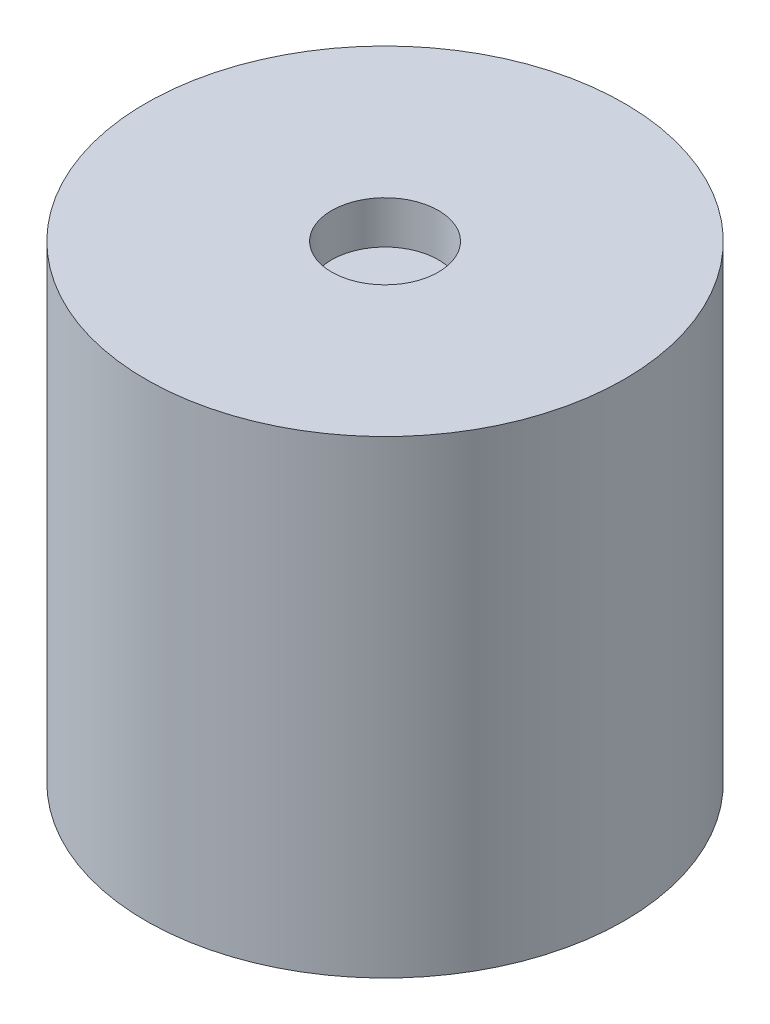
ISO-10303-21;
HEADER;
FILE_DESCRIPTION(('STEP AP214'),'2;1');
FILE_NAME('part.step','',(''),(''),'','','');
FILE_SCHEMA(('AUTOMOTIVE_DESIGN { 1 0 10303 214 1 1 1 1 }'));
ENDSEC;
DATA;
#1=APPLICATION_CONTEXT('core data for automotive mechanical design processes');
#2=APPLICATION_PROTOCOL_DEFINITION('international standard','automotive_design',2000,#1);
#3=PRODUCT_CONTEXT('',#1,'mechanical');
#4=PRODUCT('Part','Part','',(#3));
#5=PRODUCT_RELATED_PRODUCT_CATEGORY('part','',(#4));
#6=PRODUCT_DEFINITION_FORMATION('','',#4);
#7=PRODUCT_DEFINITION_CONTEXT('part definition',#1,'design');
#8=PRODUCT_DEFINITION('design','',#6,#7);
#9=PRODUCT_DEFINITION_SHAPE('','',#8);
#10=(LENGTH_UNIT() NAMED_UNIT(*) SI_UNIT(.MILLI.,.METRE.));
#11=(NAMED_UNIT(*) PLANE_ANGLE_UNIT() SI_UNIT($,.RADIAN.));
#12=(NAMED_UNIT(*) SI_UNIT($,.STERADIAN.) SOLID_ANGLE_UNIT());
#13=UNCERTAINTY_MEASURE_WITH_UNIT(LENGTH_MEASURE(1.E-05),#10,'distance_accuracy_value','');
#14=(GEOMETRIC_REPRESENTATION_CONTEXT(3) GLOBAL_UNCERTAINTY_ASSIGNED_CONTEXT((#13)) GLOBAL_UNIT_ASSIGNED_CONTEXT((#10,
#11,#12)) REPRESENTATION_CONTEXT('',''));
#15=CARTESIAN_POINT('',(0.,0.,0.));
#16=DIRECTION('',(0.,0.,1.));
#17=DIRECTION('',(1.,0.,0.));
#18=AXIS2_PLACEMENT_3D('',#15,#16,#17);
#19=CARTESIAN_POINT('',(0.,0.,0.));
#20=DIRECTION('',(0.,1.,0.));
#21=DIRECTION('',(1.,0.,0.));
#22=AXIS2_PLACEMENT_3D('',#19,#20,#21);
#23=PLANE('',#22);
#24=CARTESIAN_POINT('',(0.,0.,23.));
#25=DIRECTION('',(0.,1.,0.));
#26=DIRECTION('',(1.,0.,0.));
#27=AXIS2_PLACEMENT_3D('',#24,#25,#26);
#28=CIRCLE('',#27,3.);
#29=CARTESIAN_POINT('',(-3.,0.,23.));
#30=VERTEX_POINT('',#29);
#31=EDGE_CURVE('E126',#30,#30,#28,.T.);
#32=ORIENTED_EDGE('',*,*,#31,.T.);
#33=EDGE_LOOP('',(#32));
#34=FACE_BOUND('',#33,.T.);
#35=CARTESIAN_POINT('',(0.,0.,-23.));
#36=DIRECTION('',(0.,1.,0.));
#37=DIRECTION('',(1.,0.,0.));
#38=AXIS2_PLACEMENT_3D('',#35,#36,#37);
#39=CIRCLE('',#38,3.);
#40=CARTESIAN_POINT('',(-3.,0.,-23.));
#41=VERTEX_POINT('',#40);
#42=EDGE_CURVE('E122',#41,#41,#39,.T.);
#43=ORIENTED_EDGE('',*,*,#42,.T.);
#44=EDGE_LOOP('',(#43));
#45=FACE_BOUND('',#44,.T.);
#46=CARTESIAN_POINT('',(23.,0.,0.));
#47=DIRECTION('',(0.,1.,0.));
#48=DIRECTION('',(1.,0.,0.));
#49=AXIS2_PLACEMENT_3D('',#46,#47,#48);
#50=CIRCLE('',#49,3.);
#51=CARTESIAN_POINT('',(20.,0.,0.));
#52=VERTEX_POINT('',#51);
#53=EDGE_CURVE('E111',#52,#52,#50,.T.);
#54=ORIENTED_EDGE('',*,*,#53,.T.);
#55=EDGE_LOOP('',(#54));
#56=FACE_BOUND('',#55,.T.);
#57=CARTESIAN_POINT('',(-23.,0.,0.));
#58=DIRECTION('',(0.,1.,0.));
#59=DIRECTION('',(1.,0.,0.));
#60=AXIS2_PLACEMENT_3D('',#57,#58,#59);
#61=CIRCLE('',#60,3.);
#62=CARTESIAN_POINT('',(-26.,0.,0.));
#63=VERTEX_POINT('',#62);
#64=EDGE_CURVE('E98',#63,#63,#61,.T.);
#65=ORIENTED_EDGE('',*,*,#64,.T.);
#66=EDGE_LOOP('',(#65));
#67=FACE_BOUND('',#66,.T.);
#68=CARTESIAN_POINT('',(0.,0.,0.));
#69=DIRECTION('',(0.,1.,0.));
#70=DIRECTION('',(-1.,0.,0.));
#71=AXIS2_PLACEMENT_3D('',#68,#69,#70);
#72=CIRCLE('',#71,28.);
#73=CARTESIAN_POINT('',(28.,0.,0.));
#74=VERTEX_POINT('',#73);
#75=EDGE_CURVE('E11',#74,#74,#72,.T.);
#76=ORIENTED_EDGE('',*,*,#75,.F.);
#77=EDGE_LOOP('',(#76));
#78=FACE_BOUND('',#77,.T.);
#79=ADVANCED_FACE('F17',(#34,#45,#56,#67,#78),#23,.F.);
#80=CARTESIAN_POINT('',(0.,54.9,0.));
#81=DIRECTION('',(0.,1.,0.));
#82=DIRECTION('',(1.,0.,0.));
#83=AXIS2_PLACEMENT_3D('',#80,#81,#82);
#84=PLANE('',#83);
#85=CARTESIAN_POINT('',(0.,54.9,0.));
#86=DIRECTION('',(0.,-1.,0.));
#87=DIRECTION('',(1.,0.,0.));
#88=AXIS2_PLACEMENT_3D('',#85,#86,#87);
#89=CIRCLE('',#88,6.25);
#90=CARTESIAN_POINT('',(-6.25,54.9,0.));
#91=VERTEX_POINT('',#90);
#92=EDGE_CURVE('E106',#91,#91,#89,.T.);
#93=ORIENTED_EDGE('',*,*,#92,.T.);
#94=EDGE_LOOP('',(#93));
#95=FACE_BOUND('',#94,.T.);
#96=CARTESIAN_POINT('',(0.,54.9,0.));
#97=DIRECTION('',(0.,1.,0.));
#98=DIRECTION('',(-1.,0.,0.));
#99=AXIS2_PLACEMENT_3D('',#96,#97,#98);
#100=CIRCLE('',#99,28.);
#101=CARTESIAN_POINT('',(28.,54.9,0.));
#102=VERTEX_POINT('',#101);
#103=EDGE_CURVE('E132',#102,#102,#100,.T.);
#104=ORIENTED_EDGE('',*,*,#103,.T.);
#105=EDGE_LOOP('',(#104));
#106=FACE_BOUND('',#105,.T.);
#107=ADVANCED_FACE('F150',(#95,#106),#84,.T.);
#108=CARTESIAN_POINT('',(0.,0.,0.));
#109=DIRECTION('',(0.,1.,0.));
#110=DIRECTION('',(-1.,0.,0.));
#111=AXIS2_PLACEMENT_3D('',#108,#109,#110);
#112=CYLINDRICAL_SURFACE('',#111,28.);
#113=ORIENTED_EDGE('',*,*,#103,.F.);
#114=DIRECTION('',(0.,-1.,0.));
#115=VECTOR('',#114,1.);
#116=CARTESIAN_POINT('',(28.,0.,0.));
#117=LINE('',#116,#115);
#118=EDGE_CURVE('E28',#102,#74,#117,.T.);
#119=ORIENTED_EDGE('',*,*,#118,.T.);
#120=ORIENTED_EDGE('',*,*,#75,.T.);
#121=ORIENTED_EDGE('',*,*,#118,.F.);
#122=EDGE_LOOP('',(#113,#119,#120,#121));
#123=FACE_BOUND('',#122,.T.);
#124=ADVANCED_FACE('F153',(#123),#112,.T.);
#125=CARTESIAN_POINT('',(0.,12.,23.));
#126=DIRECTION('',(0.,-1.,0.));
#127=DIRECTION('',(0.,0.,-1.));
#128=AXIS2_PLACEMENT_3D('',#125,#126,#127);
#129=PLANE('',#128);
#130=CARTESIAN_POINT('',(0.,12.,23.));
#131=DIRECTION('',(0.,1.,0.));
#132=DIRECTION('',(1.,0.,0.));
#133=AXIS2_PLACEMENT_3D('',#130,#131,#132);
#134=CIRCLE('',#133,3.);
#135=CARTESIAN_POINT('',(-3.,12.,23.));
#136=VERTEX_POINT('',#135);
#137=EDGE_CURVE('E137',#136,#136,#134,.T.);
#138=ORIENTED_EDGE('',*,*,#137,.F.);
#139=EDGE_LOOP('',(#138));
#140=FACE_BOUND('',#139,.T.);
#141=ADVANCED_FACE('F156',(#140),#129,.T.);
#142=CARTESIAN_POINT('',(0.,0.,23.));
#143=DIRECTION('',(0.,1.,0.));
#144=DIRECTION('',(1.,0.,0.));
#145=AXIS2_PLACEMENT_3D('',#142,#143,#144);
#146=CYLINDRICAL_SURFACE('',#145,3.);
#147=ORIENTED_EDGE('',*,*,#31,.F.);
#148=DIRECTION('',(0.,1.,0.));
#149=VECTOR('',#148,1.);
#150=CARTESIAN_POINT('',(-3.,0.,23.));
#151=LINE('',#150,#149);
#152=EDGE_CURVE('E130',#30,#136,#151,.T.);
#153=ORIENTED_EDGE('',*,*,#152,.T.);
#154=ORIENTED_EDGE('',*,*,#137,.T.);
#155=ORIENTED_EDGE('',*,*,#152,.F.);
#156=EDGE_LOOP('',(#147,#153,#154,#155));
#157=FACE_BOUND('',#156,.T.);
#158=ADVANCED_FACE('F163',(#157),#146,.F.);
#159=CARTESIAN_POINT('',(0.,12.,-23.));
#160=DIRECTION('',(0.,-1.,0.));
#161=DIRECTION('',(0.,0.,-1.));
#162=AXIS2_PLACEMENT_3D('',#159,#160,#161);
#163=PLANE('',#162);
#164=CARTESIAN_POINT('',(0.,12.,-23.));
#165=DIRECTION('',(0.,1.,0.));
#166=DIRECTION('',(1.,0.,0.));
#167=AXIS2_PLACEMENT_3D('',#164,#165,#166);
#168=CIRCLE('',#167,3.);
#169=CARTESIAN_POINT('',(-3.,12.,-23.));
#170=VERTEX_POINT('',#169);
#171=EDGE_CURVE('E21',#170,#170,#168,.T.);
#172=ORIENTED_EDGE('',*,*,#171,.F.);
#173=EDGE_LOOP('',(#172));
#174=FACE_BOUND('',#173,.T.);
#175=ADVANCED_FACE('F179',(#174),#163,.T.);
#176=CARTESIAN_POINT('',(0.,0.,-23.));
#177=DIRECTION('',(0.,1.,0.));
#178=DIRECTION('',(1.,0.,0.));
#179=AXIS2_PLACEMENT_3D('',#176,#177,#178);
#180=CYLINDRICAL_SURFACE('',#179,3.);
#181=ORIENTED_EDGE('',*,*,#42,.F.);
#182=DIRECTION('',(0.,1.,0.));
#183=VECTOR('',#182,1.);
#184=CARTESIAN_POINT('',(-3.,0.,-23.));
#185=LINE('',#184,#183);
#186=EDGE_CURVE('E110',#41,#170,#185,.T.);
#187=ORIENTED_EDGE('',*,*,#186,.T.);
#188=ORIENTED_EDGE('',*,*,#171,.T.);
#189=ORIENTED_EDGE('',*,*,#186,.F.);
#190=EDGE_LOOP('',(#181,#187,#188,#189));
#191=FACE_BOUND('',#190,.T.);
#192=ADVANCED_FACE('F175',(#191),#180,.F.);
#193=CARTESIAN_POINT('',(23.,12.,0.));
#194=DIRECTION('',(0.,-1.,0.));
#195=DIRECTION('',(0.,0.,-1.));
#196=AXIS2_PLACEMENT_3D('',#193,#194,#195);
#197=PLANE('',#196);
#198=CARTESIAN_POINT('',(23.,12.,0.));
#199=DIRECTION('',(0.,1.,0.));
#200=DIRECTION('',(1.,0.,0.));
#201=AXIS2_PLACEMENT_3D('',#198,#199,#200);
#202=CIRCLE('',#201,3.);
#203=CARTESIAN_POINT('',(20.,12.,0.));
#204=VERTEX_POINT('',#203);
#205=EDGE_CURVE('E121',#204,#204,#202,.T.);
#206=ORIENTED_EDGE('',*,*,#205,.F.);
#207=EDGE_LOOP('',(#206));
#208=FACE_BOUND('',#207,.T.);
#209=ADVANCED_FACE('F178',(#208),#197,.T.);
#210=CARTESIAN_POINT('',(23.,0.,0.));
#211=DIRECTION('',(0.,1.,0.));
#212=DIRECTION('',(1.,0.,0.));
#213=AXIS2_PLACEMENT_3D('',#210,#211,#212);
#214=CYLINDRICAL_SURFACE('',#213,3.);
#215=ORIENTED_EDGE('',*,*,#53,.F.);
#216=DIRECTION('',(0.,1.,0.));
#217=VECTOR('',#216,1.);
#218=CARTESIAN_POINT('',(20.,0.,0.));
#219=LINE('',#218,#217);
#220=EDGE_CURVE('E115',#52,#204,#219,.T.);
#221=ORIENTED_EDGE('',*,*,#220,.T.);
#222=ORIENTED_EDGE('',*,*,#205,.T.);
#223=ORIENTED_EDGE('',*,*,#220,.F.);
#224=EDGE_LOOP('',(#215,#221,#222,#223));
#225=FACE_BOUND('',#224,.T.);
#226=ADVANCED_FACE('F184',(#225),#214,.F.);
#227=CARTESIAN_POINT('',(-23.,12.,0.));
#228=DIRECTION('',(0.,-1.,0.));
#229=DIRECTION('',(0.,0.,-1.));
#230=AXIS2_PLACEMENT_3D('',#227,#228,#229);
#231=PLANE('',#230);
#232=CARTESIAN_POINT('',(-23.,12.,0.));
#233=DIRECTION('',(0.,1.,0.));
#234=DIRECTION('',(1.,0.,0.));
#235=AXIS2_PLACEMENT_3D('',#232,#233,#234);
#236=CIRCLE('',#235,3.);
#237=CARTESIAN_POINT('',(-26.,12.,0.));
#238=VERTEX_POINT('',#237);
#239=EDGE_CURVE('E79',#238,#238,#236,.T.);
#240=ORIENTED_EDGE('',*,*,#239,.F.);
#241=EDGE_LOOP('',(#240));
#242=FACE_BOUND('',#241,.T.);
#243=ADVANCED_FACE('F187',(#242),#231,.T.);
#244=CARTESIAN_POINT('',(-23.,0.,0.));
#245=DIRECTION('',(0.,1.,0.));
#246=DIRECTION('',(1.,0.,0.));
#247=AXIS2_PLACEMENT_3D('',#244,#245,#246);
#248=CYLINDRICAL_SURFACE('',#247,3.);
#249=ORIENTED_EDGE('',*,*,#64,.F.);
#250=DIRECTION('',(0.,1.,0.));
#251=VECTOR('',#250,1.);
#252=CARTESIAN_POINT('',(-26.,0.,0.));
#253=LINE('',#252,#251);
#254=EDGE_CURVE('E84',#63,#238,#253,.T.);
#255=ORIENTED_EDGE('',*,*,#254,.T.);
#256=ORIENTED_EDGE('',*,*,#239,.T.);
#257=ORIENTED_EDGE('',*,*,#254,.F.);
#258=EDGE_LOOP('',(#249,#255,#256,#257));
#259=FACE_BOUND('',#258,.T.);
#260=ADVANCED_FACE('F190',(#259),#248,.F.);
#261=CARTESIAN_POINT('',(0.,49.9,0.));
#262=DIRECTION('',(0.,1.,0.));
#263=DIRECTION('',(1.,0.,0.));
#264=AXIS2_PLACEMENT_3D('',#261,#262,#263);
#265=PLANE('',#264);
#266=CARTESIAN_POINT('',(0.,49.9,0.));
#267=DIRECTION('',(0.,-1.,0.));
#268=DIRECTION('',(1.,0.,0.));
#269=AXIS2_PLACEMENT_3D('',#266,#267,#268);
#270=CIRCLE('',#269,6.25);
#271=CARTESIAN_POINT('',(-6.25,49.9,0.));
#272=VERTEX_POINT('',#271);
#273=EDGE_CURVE('E91',#272,#272,#270,.T.);
#274=ORIENTED_EDGE('',*,*,#273,.F.);
#275=EDGE_LOOP('',(#274));
#276=FACE_BOUND('',#275,.T.);
#277=ADVANCED_FACE('F19',(#276),#265,.T.);
#278=CARTESIAN_POINT('',(0.,54.9,0.));
#279=DIRECTION('',(0.,-1.,0.));
#280=DIRECTION('',(1.,0.,0.));
#281=AXIS2_PLACEMENT_3D('',#278,#279,#280);
#282=CYLINDRICAL_SURFACE('',#281,6.25);
#283=ORIENTED_EDGE('',*,*,#92,.F.);
#284=DIRECTION('',(0.,-1.,0.));
#285=VECTOR('',#284,1.);
#286=CARTESIAN_POINT('',(-6.25,54.9,0.));
#287=LINE('',#286,#285);
#288=EDGE_CURVE('E94',#91,#272,#287,.T.);
#289=ORIENTED_EDGE('',*,*,#288,.T.);
#290=ORIENTED_EDGE('',*,*,#273,.T.);
#291=ORIENTED_EDGE('',*,*,#288,.F.);
#292=EDGE_LOOP('',(#283,#289,#290,#291));
#293=FACE_BOUND('',#292,.T.);
#294=ADVANCED_FACE('F93',(#293),#282,.F.);
#295=CLOSED_SHELL('',(#79,#107,#124,#141,#158,#175,#192,#209,#226,#243,#260,#277,#294));
#296=MANIFOLD_SOLID_BREP('B1',#295);
#297=ADVANCED_BREP_SHAPE_REPRESENTATION('',(#18,#296),#14);
#298=SHAPE_DEFINITION_REPRESENTATION(#9,#297);
ENDSEC;
END-ISO-10303-21;
